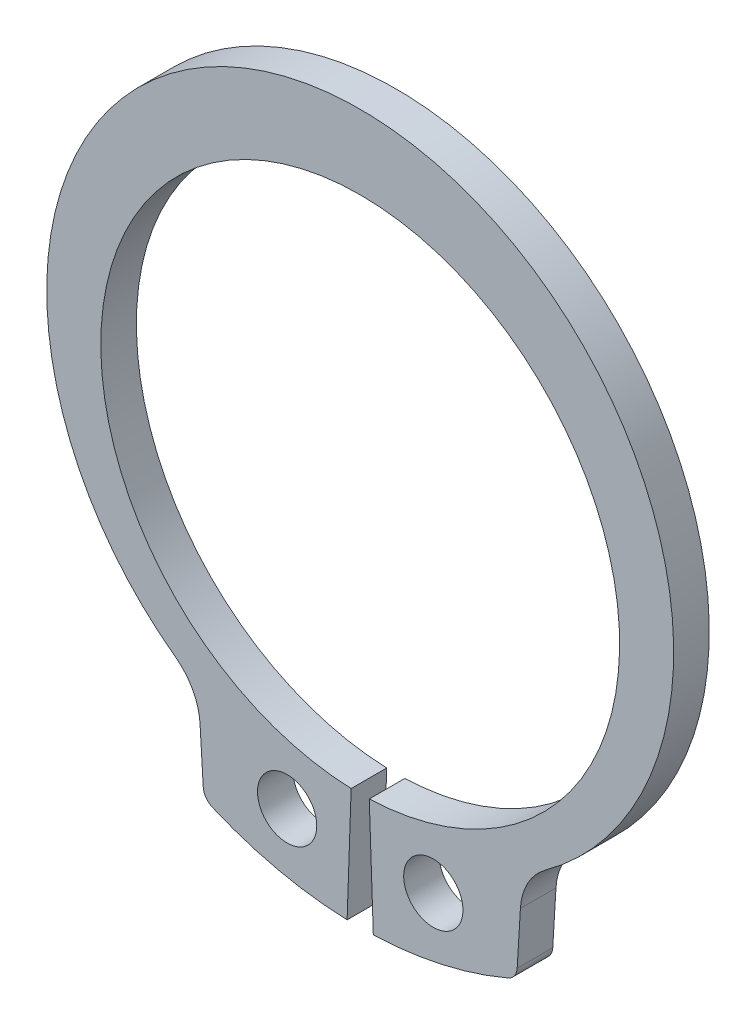
ISO-10303-21;
HEADER;
FILE_DESCRIPTION(('STEP AP214'),'2;1');
FILE_NAME('part.step','',(''),(''),'','','');
FILE_SCHEMA(('AUTOMOTIVE_DESIGN { 1 0 10303 214 1 1 1 1 }'));
ENDSEC;
DATA;
#1=APPLICATION_CONTEXT('core data for automotive mechanical design processes');
#2=APPLICATION_PROTOCOL_DEFINITION('international standard','automotive_design',2000,#1);
#3=PRODUCT_CONTEXT('',#1,'mechanical');
#4=PRODUCT('Part','Part','',(#3));
#5=PRODUCT_RELATED_PRODUCT_CATEGORY('part','',(#4));
#6=PRODUCT_DEFINITION_FORMATION('','',#4);
#7=PRODUCT_DEFINITION_CONTEXT('part definition',#1,'design');
#8=PRODUCT_DEFINITION('design','',#6,#7);
#9=PRODUCT_DEFINITION_SHAPE('','',#8);
#10=(LENGTH_UNIT() NAMED_UNIT(*) SI_UNIT(.MILLI.,.METRE.));
#11=(NAMED_UNIT(*) PLANE_ANGLE_UNIT() SI_UNIT($,.RADIAN.));
#12=(NAMED_UNIT(*) SI_UNIT($,.STERADIAN.) SOLID_ANGLE_UNIT());
#13=UNCERTAINTY_MEASURE_WITH_UNIT(LENGTH_MEASURE(1.E-05),#10,'distance_accuracy_value','');
#14=(GEOMETRIC_REPRESENTATION_CONTEXT(3) GLOBAL_UNCERTAINTY_ASSIGNED_CONTEXT((#13)) GLOBAL_UNIT_ASSIGNED_CONTEXT((#10,
#11,#12)) REPRESENTATION_CONTEXT('',''));
#15=CARTESIAN_POINT('',(0.,0.,0.));
#16=DIRECTION('',(0.,0.,1.));
#17=DIRECTION('',(1.,0.,0.));
#18=AXIS2_PLACEMENT_3D('',#15,#16,#17);
#19=CARTESIAN_POINT('',(0.,0.676745281118012,0.6));
#20=DIRECTION('',(0.,0.,1.));
#21=DIRECTION('',(1.,0.,0.));
#22=AXIS2_PLACEMENT_3D('',#19,#20,#21);
#23=PLANE('',#22);
#24=DIRECTION('',(0.0600552125805583,-0.998195056810994,0.));
#25=VECTOR('',#24,1.);
#26=CARTESIAN_POINT('',(-5.27574090146537,-11.5058332597497,0.6));
#27=LINE('',#26,#25);
#28=CARTESIAN_POINT('',(-5.40286054256007,-9.39294094096705,0.6));
#29=VERTEX_POINT('',#28);
#30=CARTESIAN_POINT('',(-5.29450519168984,-11.1939465651267,0.6));
#31=VERTEX_POINT('',#30);
#32=EDGE_CURVE('E196',#29,#31,#27,.T.);
#33=ORIENTED_EDGE('',*,*,#32,.T.);
#34=CARTESIAN_POINT('',(-4.78193236818255,-11.1631082338119,0.6));
#35=DIRECTION('',(0.,0.,1.));
#36=DIRECTION('',(1.,0.,0.));
#37=AXIS2_PLACEMENT_3D('',#34,#35,#36);
#38=CIRCLE('',#37,0.513499661223369);
#39=CARTESIAN_POINT('',(-4.98412917092754,-11.6351234401731,0.6));
#40=VERTEX_POINT('',#39);
#41=EDGE_CURVE('E12',#31,#40,#38,.T.);
#42=ORIENTED_EDGE('',*,*,#41,.T.);
#43=CARTESIAN_POINT('',(0.,0.,0.6));
#44=DIRECTION('',(0.,0.,1.));
#45=DIRECTION('',(1.,0.,0.));
#46=AXIS2_PLACEMENT_3D('',#43,#44,#45);
#47=CIRCLE('',#46,12.6577107353801);
#48=CARTESIAN_POINT('',(-0.441747734070617,-12.65,0.6));
#49=VERTEX_POINT('',#48);
#50=EDGE_CURVE('E199',#40,#49,#47,.T.);
#51=ORIENTED_EDGE('',*,*,#50,.T.);
#52=DIRECTION('',(0.0348994967024998,0.999390827019096,0.));
#53=VECTOR('',#52,1.);
#54=CARTESIAN_POINT('',(-0.441747734070617,-12.65,0.6));
#55=LINE('',#54,#53);
#56=CARTESIAN_POINT('',(-0.305370596146897,-8.74466973641709,0.6));
#57=VERTEX_POINT('',#56);
#58=EDGE_CURVE('E201',#49,#57,#55,.T.);
#59=ORIENTED_EDGE('',*,*,#58,.T.);
#60=CARTESIAN_POINT('',(0.,0.,0.6));
#61=DIRECTION('',(0.,0.,-1.));
#62=DIRECTION('',(1.,0.,0.));
#63=AXIS2_PLACEMENT_3D('',#60,#61,#62);
#64=CIRCLE('',#63,8.75);
#65=CARTESIAN_POINT('',(0.305370596146893,-8.74466973641709,0.6));
#66=VERTEX_POINT('',#65);
#67=EDGE_CURVE('E155',#57,#66,#64,.T.);
#68=ORIENTED_EDGE('',*,*,#67,.T.);
#69=DIRECTION('',(-0.0348994967024993,0.999390827019096,0.));
#70=VECTOR('',#69,1.);
#71=CARTESIAN_POINT('',(0.441747734070611,-12.65,0.6));
#72=LINE('',#71,#70);
#73=CARTESIAN_POINT('',(0.441747734070611,-12.65,0.6));
#74=VERTEX_POINT('',#73);
#75=EDGE_CURVE('E135',#74,#66,#72,.T.);
#76=ORIENTED_EDGE('',*,*,#75,.F.);
#77=CARTESIAN_POINT('',(0.,0.,0.6));
#78=DIRECTION('',(0.,0.,-1.));
#79=DIRECTION('',(-1.,0.,0.));
#80=AXIS2_PLACEMENT_3D('',#77,#78,#79);
#81=CIRCLE('',#80,12.6577107353801);
#82=CARTESIAN_POINT('',(4.98412917092754,-11.6351234401731,0.6));
#83=VERTEX_POINT('',#82);
#84=EDGE_CURVE('E145',#83,#74,#81,.T.);
#85=ORIENTED_EDGE('',*,*,#84,.F.);
#86=CARTESIAN_POINT('',(4.78193236818255,-11.1631082338119,0.6));
#87=DIRECTION('',(0.,0.,-1.));
#88=DIRECTION('',(-1.,0.,0.));
#89=AXIS2_PLACEMENT_3D('',#86,#87,#88);
#90=CIRCLE('',#89,0.513499661223369);
#91=CARTESIAN_POINT('',(5.29450519168983,-11.1939465651267,0.6));
#92=VERTEX_POINT('',#91);
#93=EDGE_CURVE('E184',#92,#83,#90,.T.);
#94=ORIENTED_EDGE('',*,*,#93,.F.);
#95=DIRECTION('',(-0.0600552125805588,-0.998195056810994,0.));
#96=VECTOR('',#95,1.);
#97=CARTESIAN_POINT('',(5.27574090146536,-11.5058332597497,0.6));
#98=LINE('',#97,#96);
#99=CARTESIAN_POINT('',(5.40286054256007,-9.39294094096706,0.6));
#100=VERTEX_POINT('',#99);
#101=EDGE_CURVE('E151',#100,#92,#98,.T.);
#102=ORIENTED_EDGE('',*,*,#101,.F.);
#103=CARTESIAN_POINT('',(7.45315183658921,-9.51629426622631,0.6));
#104=DIRECTION('',(0.,0.,-1.));
#105=DIRECTION('',(-1.,0.,0.));
#106=AXIS2_PLACEMENT_3D('',#103,#104,#105);
#107=CIRCLE('',#106,2.05399864489347);
#108=CARTESIAN_POINT('',(6.24079287526064,-7.85825440479037,0.6));
#109=VERTEX_POINT('',#108);
#110=EDGE_CURVE('E175',#109,#100,#107,.F.);
#111=ORIENTED_EDGE('',*,*,#110,.F.);
#112=CARTESIAN_POINT('',(0.,0.676745281118012,0.6));
#113=DIRECTION('',(0.,0.,1.));
#114=DIRECTION('',(1.,0.,0.));
#115=AXIS2_PLACEMENT_3D('',#112,#113,#114);
#116=CIRCLE('',#115,10.573254718882);
#117=CARTESIAN_POINT('',(-6.24079287526064,-7.85825440479036,0.6));
#118=VERTEX_POINT('',#117);
#119=EDGE_CURVE('E193',#109,#118,#116,.T.);
#120=ORIENTED_EDGE('',*,*,#119,.T.);
#121=CARTESIAN_POINT('',(-7.45315183658922,-9.51629426622631,0.6));
#122=DIRECTION('',(0.,0.,1.));
#123=DIRECTION('',(1.,0.,0.));
#124=AXIS2_PLACEMENT_3D('',#121,#122,#123);
#125=CIRCLE('',#124,2.05399864489347);
#126=EDGE_CURVE('E226',#118,#29,#125,.F.);
#127=ORIENTED_EDGE('',*,*,#126,.T.);
#128=EDGE_LOOP('',(#33,#42,#51,#59,#68,#76,#85,#94,#102,#111,#120,#127));
#129=FACE_BOUND('',#128,.T.);
#130=CARTESIAN_POINT('',(-2.46539678263405,-10.416061560715,0.6));
#131=DIRECTION('',(0.,0.,1.));
#132=DIRECTION('',(1.,0.,0.));
#133=AXIS2_PLACEMENT_3D('',#130,#131,#132);
#134=CIRCLE('',#133,1.);
#135=CARTESIAN_POINT('',(-1.46539678263405,-10.416061560715,0.6));
#136=VERTEX_POINT('',#135);
#137=EDGE_CURVE('E187',#136,#136,#134,.T.);
#138=ORIENTED_EDGE('',*,*,#137,.F.);
#139=EDGE_LOOP('',(#138));
#140=FACE_BOUND('',#139,.T.);
#141=CARTESIAN_POINT('',(2.46539678263404,-10.416061560715,0.6));
#142=DIRECTION('',(0.,0.,-1.));
#143=DIRECTION('',(-1.,0.,0.));
#144=AXIS2_PLACEMENT_3D('',#141,#142,#143);
#145=CIRCLE('',#144,1.);
#146=CARTESIAN_POINT('',(1.46539678263404,-10.416061560715,0.6));
#147=VERTEX_POINT('',#146);
#148=EDGE_CURVE('E165',#147,#147,#145,.T.);
#149=ORIENTED_EDGE('',*,*,#148,.T.);
#150=EDGE_LOOP('',(#149));
#151=FACE_BOUND('',#150,.T.);
#152=ADVANCED_FACE('F41',(#129,#140,#151),#23,.T.);
#153=CARTESIAN_POINT('',(0.,0.676745281118012,-0.6));
#154=DIRECTION('',(0.,0.,1.));
#155=DIRECTION('',(1.,0.,0.));
#156=AXIS2_PLACEMENT_3D('',#153,#154,#155);
#157=PLANE('',#156);
#158=CARTESIAN_POINT('',(0.,0.,-0.6));
#159=DIRECTION('',(0.,0.,1.));
#160=DIRECTION('',(1.,0.,0.));
#161=AXIS2_PLACEMENT_3D('',#158,#159,#160);
#162=CIRCLE('',#161,12.6577107353801);
#163=CARTESIAN_POINT('',(-4.98412917092754,-11.6351234401731,-0.6));
#164=VERTEX_POINT('',#163);
#165=CARTESIAN_POINT('',(-0.441747734070617,-12.65,-0.6));
#166=VERTEX_POINT('',#165);
#167=EDGE_CURVE('E209',#164,#166,#162,.T.);
#168=ORIENTED_EDGE('',*,*,#167,.F.);
#169=CARTESIAN_POINT('',(-4.78193236818255,-11.1631082338119,-0.6));
#170=DIRECTION('',(0.,0.,1.));
#171=DIRECTION('',(1.,0.,0.));
#172=AXIS2_PLACEMENT_3D('',#169,#170,#171);
#173=CIRCLE('',#172,0.513499661223369);
#174=CARTESIAN_POINT('',(-5.29450519168984,-11.1939465651267,-0.6));
#175=VERTEX_POINT('',#174);
#176=EDGE_CURVE('E63',#164,#175,#173,.F.);
#177=ORIENTED_EDGE('',*,*,#176,.T.);
#178=DIRECTION('',(0.0600552125805583,-0.998195056810994,0.));
#179=VECTOR('',#178,1.);
#180=CARTESIAN_POINT('',(-5.27574090146537,-11.5058332597497,-0.6));
#181=LINE('',#180,#179);
#182=CARTESIAN_POINT('',(-5.40286054256007,-9.39294094096705,-0.6));
#183=VERTEX_POINT('',#182);
#184=EDGE_CURVE('E207',#183,#175,#181,.T.);
#185=ORIENTED_EDGE('',*,*,#184,.F.);
#186=CARTESIAN_POINT('',(-7.45315183658922,-9.51629426622631,-0.6));
#187=DIRECTION('',(0.,0.,1.));
#188=DIRECTION('',(1.,0.,0.));
#189=AXIS2_PLACEMENT_3D('',#186,#187,#188);
#190=CIRCLE('',#189,2.05399864489347);
#191=CARTESIAN_POINT('',(-6.24079287526064,-7.85825440479036,-0.6));
#192=VERTEX_POINT('',#191);
#193=EDGE_CURVE('E224',#183,#192,#190,.T.);
#194=ORIENTED_EDGE('',*,*,#193,.T.);
#195=CARTESIAN_POINT('',(0.,0.676745281118012,-0.6));
#196=DIRECTION('',(0.,0.,1.));
#197=DIRECTION('',(1.,0.,0.));
#198=AXIS2_PLACEMENT_3D('',#195,#196,#197);
#199=CIRCLE('',#198,10.573254718882);
#200=CARTESIAN_POINT('',(6.24079287526064,-7.85825440479037,-0.6));
#201=VERTEX_POINT('',#200);
#202=EDGE_CURVE('E190',#201,#192,#199,.T.);
#203=ORIENTED_EDGE('',*,*,#202,.F.);
#204=CARTESIAN_POINT('',(7.45315183658921,-9.51629426622631,-0.6));
#205=DIRECTION('',(0.,0.,-1.));
#206=DIRECTION('',(-1.,0.,0.));
#207=AXIS2_PLACEMENT_3D('',#204,#205,#206);
#208=CIRCLE('',#207,2.05399864489347);
#209=CARTESIAN_POINT('',(5.40286054256007,-9.39294094096706,-0.6));
#210=VERTEX_POINT('',#209);
#211=EDGE_CURVE('E172',#210,#201,#208,.T.);
#212=ORIENTED_EDGE('',*,*,#211,.F.);
#213=DIRECTION('',(-0.0600552125805588,-0.998195056810994,0.));
#214=VECTOR('',#213,1.);
#215=CARTESIAN_POINT('',(5.27574090146536,-11.5058332597497,-0.6));
#216=LINE('',#215,#214);
#217=CARTESIAN_POINT('',(5.29450519168983,-11.1939465651267,-0.6));
#218=VERTEX_POINT('',#217);
#219=EDGE_CURVE('E161',#210,#218,#216,.T.);
#220=ORIENTED_EDGE('',*,*,#219,.T.);
#221=CARTESIAN_POINT('',(4.78193236818255,-11.1631082338119,-0.6));
#222=DIRECTION('',(0.,0.,-1.));
#223=DIRECTION('',(-1.,0.,0.));
#224=AXIS2_PLACEMENT_3D('',#221,#222,#223);
#225=CIRCLE('',#224,0.513499661223369);
#226=CARTESIAN_POINT('',(4.98412917092754,-11.6351234401731,-0.6));
#227=VERTEX_POINT('',#226);
#228=EDGE_CURVE('E179',#227,#218,#225,.F.);
#229=ORIENTED_EDGE('',*,*,#228,.F.);
#230=CARTESIAN_POINT('',(0.,0.,-0.6));
#231=DIRECTION('',(0.,0.,-1.));
#232=DIRECTION('',(-1.,0.,0.));
#233=AXIS2_PLACEMENT_3D('',#230,#231,#232);
#234=CIRCLE('',#233,12.6577107353801);
#235=CARTESIAN_POINT('',(0.441747734070611,-12.65,-0.6));
#236=VERTEX_POINT('',#235);
#237=EDGE_CURVE('E164',#227,#236,#234,.T.);
#238=ORIENTED_EDGE('',*,*,#237,.T.);
#239=DIRECTION('',(-0.0348994967024993,0.999390827019096,0.));
#240=VECTOR('',#239,1.);
#241=CARTESIAN_POINT('',(0.441747734070611,-12.65,-0.6));
#242=LINE('',#241,#240);
#243=CARTESIAN_POINT('',(0.305370596146893,-8.74466973641709,-0.6));
#244=VERTEX_POINT('',#243);
#245=EDGE_CURVE('E137',#236,#244,#242,.T.);
#246=ORIENTED_EDGE('',*,*,#245,.T.);
#247=CARTESIAN_POINT('',(0.,0.,-0.6));
#248=DIRECTION('',(0.,0.,-1.));
#249=DIRECTION('',(1.,0.,0.));
#250=AXIS2_PLACEMENT_3D('',#247,#248,#249);
#251=CIRCLE('',#250,8.75);
#252=CARTESIAN_POINT('',(-0.305370596146897,-8.74466973641709,-0.6));
#253=VERTEX_POINT('',#252);
#254=EDGE_CURVE('E197',#253,#244,#251,.T.);
#255=ORIENTED_EDGE('',*,*,#254,.F.);
#256=DIRECTION('',(0.0348994967024998,0.999390827019096,0.));
#257=VECTOR('',#256,1.);
#258=CARTESIAN_POINT('',(-0.441747734070617,-12.65,-0.6));
#259=LINE('',#258,#257);
#260=EDGE_CURVE('E211',#166,#253,#259,.T.);
#261=ORIENTED_EDGE('',*,*,#260,.F.);
#262=EDGE_LOOP('',(#168,#177,#185,#194,#203,#212,#220,#229,#238,#246,#255,#261));
#263=FACE_BOUND('',#262,.T.);
#264=CARTESIAN_POINT('',(-2.46539678263405,-10.416061560715,-0.6));
#265=DIRECTION('',(0.,0.,1.));
#266=DIRECTION('',(1.,0.,0.));
#267=AXIS2_PLACEMENT_3D('',#264,#265,#266);
#268=CIRCLE('',#267,1.);
#269=CARTESIAN_POINT('',(-1.46539678263405,-10.416061560715,-0.6));
#270=VERTEX_POINT('',#269);
#271=EDGE_CURVE('E186',#270,#270,#268,.T.);
#272=ORIENTED_EDGE('',*,*,#271,.T.);
#273=EDGE_LOOP('',(#272));
#274=FACE_BOUND('',#273,.T.);
#275=CARTESIAN_POINT('',(2.46539678263404,-10.416061560715,-0.6));
#276=DIRECTION('',(0.,0.,-1.));
#277=DIRECTION('',(-1.,0.,0.));
#278=AXIS2_PLACEMENT_3D('',#275,#276,#277);
#279=CIRCLE('',#278,1.);
#280=CARTESIAN_POINT('',(1.46539678263404,-10.416061560715,-0.6));
#281=VERTEX_POINT('',#280);
#282=EDGE_CURVE('E259',#281,#281,#279,.T.);
#283=ORIENTED_EDGE('',*,*,#282,.F.);
#284=EDGE_LOOP('',(#283));
#285=FACE_BOUND('',#284,.T.);
#286=ADVANCED_FACE('F239',(#263,#274,#285),#157,.F.);
#287=CARTESIAN_POINT('',(0.,0.676745281118012,0.6));
#288=DIRECTION('',(0.,0.,-1.));
#289=DIRECTION('',(-1.,0.,0.));
#290=AXIS2_PLACEMENT_3D('',#287,#288,#289);
#291=CYLINDRICAL_SURFACE('',#290,10.573254718882);
#292=ORIENTED_EDGE('',*,*,#202,.T.);
#293=DIRECTION('',(0.,0.,-1.));
#294=VECTOR('',#293,1.);
#295=CARTESIAN_POINT('',(-6.24079287526064,-7.85825440479036,0.6));
#296=LINE('',#295,#294);
#297=EDGE_CURVE('E222',#192,#118,#296,.F.);
#298=ORIENTED_EDGE('',*,*,#297,.T.);
#299=ORIENTED_EDGE('',*,*,#119,.F.);
#300=DIRECTION('',(0.,0.,-1.));
#301=VECTOR('',#300,1.);
#302=CARTESIAN_POINT('',(6.24079287526064,-7.85825440479037,0.6));
#303=LINE('',#302,#301);
#304=EDGE_CURVE('E169',#201,#109,#303,.F.);
#305=ORIENTED_EDGE('',*,*,#304,.F.);
#306=EDGE_LOOP('',(#292,#298,#299,#305));
#307=FACE_BOUND('',#306,.T.);
#308=ADVANCED_FACE('F274',(#307),#291,.T.);
#309=CARTESIAN_POINT('',(-5.27574090146537,-11.5058332597497,0.6));
#310=DIRECTION('',(0.998195056810994,0.0600552125805583,0.));
#311=DIRECTION('',(-0.0600552125805583,0.998195056810994,0.));
#312=AXIS2_PLACEMENT_3D('',#309,#310,#311);
#313=PLANE('',#312);
#314=ORIENTED_EDGE('',*,*,#184,.T.);
#315=DIRECTION('',(0.,0.,-1.));
#316=VECTOR('',#315,1.);
#317=CARTESIAN_POINT('',(-5.29450519168984,-11.1939465651267,0.6));
#318=LINE('',#317,#316);
#319=EDGE_CURVE('E49',#175,#31,#318,.F.);
#320=ORIENTED_EDGE('',*,*,#319,.T.);
#321=ORIENTED_EDGE('',*,*,#32,.F.);
#322=DIRECTION('',(0.,0.,1.));
#323=VECTOR('',#322,1.);
#324=CARTESIAN_POINT('',(-5.40286054256007,-9.39294094096705,-0.6));
#325=LINE('',#324,#323);
#326=EDGE_CURVE('E219',#29,#183,#325,.F.);
#327=ORIENTED_EDGE('',*,*,#326,.T.);
#328=EDGE_LOOP('',(#314,#320,#321,#327));
#329=FACE_BOUND('',#328,.T.);
#330=ADVANCED_FACE('F280',(#329),#313,.F.);
#331=CARTESIAN_POINT('',(0.,0.,0.6));
#332=DIRECTION('',(0.,0.,-1.));
#333=DIRECTION('',(-1.,0.,0.));
#334=AXIS2_PLACEMENT_3D('',#331,#332,#333);
#335=CYLINDRICAL_SURFACE('',#334,12.6577107353801);
#336=ORIENTED_EDGE('',*,*,#50,.F.);
#337=DIRECTION('',(0.,0.,-1.));
#338=VECTOR('',#337,1.);
#339=CARTESIAN_POINT('',(-4.98412917092754,-11.6351234401731,0.6));
#340=LINE('',#339,#338);
#341=EDGE_CURVE('E228',#40,#164,#340,.T.);
#342=ORIENTED_EDGE('',*,*,#341,.T.);
#343=ORIENTED_EDGE('',*,*,#167,.T.);
#344=DIRECTION('',(0.,0.,-1.));
#345=VECTOR('',#344,1.);
#346=CARTESIAN_POINT('',(-0.441747734070617,-12.65,0.6));
#347=LINE('',#346,#345);
#348=EDGE_CURVE('E216',#49,#166,#347,.T.);
#349=ORIENTED_EDGE('',*,*,#348,.F.);
#350=EDGE_LOOP('',(#336,#342,#343,#349));
#351=FACE_BOUND('',#350,.T.);
#352=ADVANCED_FACE('F234',(#351),#335,.T.);
#353=CARTESIAN_POINT('',(-0.441747734070617,-12.65,0.6));
#354=DIRECTION('',(-0.999390827019096,0.0348994967024998,0.));
#355=DIRECTION('',(-0.0348994967024998,-0.999390827019096,0.));
#356=AXIS2_PLACEMENT_3D('',#353,#354,#355);
#357=PLANE('',#356);
#358=ORIENTED_EDGE('',*,*,#260,.T.);
#359=DIRECTION('',(0.,0.,-1.));
#360=VECTOR('',#359,1.);
#361=CARTESIAN_POINT('',(-0.305370596146897,-8.74466973641709,0.6));
#362=LINE('',#361,#360);
#363=EDGE_CURVE('E204',#57,#253,#362,.T.);
#364=ORIENTED_EDGE('',*,*,#363,.F.);
#365=ORIENTED_EDGE('',*,*,#58,.F.);
#366=ORIENTED_EDGE('',*,*,#348,.T.);
#367=EDGE_LOOP('',(#358,#364,#365,#366));
#368=FACE_BOUND('',#367,.T.);
#369=ADVANCED_FACE('F244',(#368),#357,.F.);
#370=CARTESIAN_POINT('',(0.,0.,0.6));
#371=DIRECTION('',(0.,0.,-1.));
#372=DIRECTION('',(-1.,0.,0.));
#373=AXIS2_PLACEMENT_3D('',#370,#371,#372);
#374=CYLINDRICAL_SURFACE('',#373,8.75);
#375=ORIENTED_EDGE('',*,*,#254,.T.);
#376=DIRECTION('',(0.,0.,-1.));
#377=VECTOR('',#376,1.);
#378=CARTESIAN_POINT('',(0.305370596146893,-8.74466973641709,0.6));
#379=LINE('',#378,#377);
#380=EDGE_CURVE('E142',#66,#244,#379,.T.);
#381=ORIENTED_EDGE('',*,*,#380,.F.);
#382=ORIENTED_EDGE('',*,*,#67,.F.);
#383=ORIENTED_EDGE('',*,*,#363,.T.);
#384=EDGE_LOOP('',(#375,#381,#382,#383));
#385=FACE_BOUND('',#384,.T.);
#386=ADVANCED_FACE('F247',(#385),#374,.F.);
#387=CARTESIAN_POINT('',(-2.46539678263405,-10.416061560715,0.6));
#388=DIRECTION('',(0.,0.,-1.));
#389=DIRECTION('',(-1.,0.,0.));
#390=AXIS2_PLACEMENT_3D('',#387,#388,#389);
#391=CYLINDRICAL_SURFACE('',#390,1.);
#392=ORIENTED_EDGE('',*,*,#137,.T.);
#393=EDGE_LOOP('',(#392));
#394=FACE_BOUND('',#393,.T.);
#395=ORIENTED_EDGE('',*,*,#271,.F.);
#396=EDGE_LOOP('',(#395));
#397=FACE_BOUND('',#396,.T.);
#398=ADVANCED_FACE('F288',(#394,#397),#391,.F.);
#399=CARTESIAN_POINT('',(-7.45315183658922,-9.51629426622631,0.6));
#400=DIRECTION('',(0.,0.,-1.));
#401=DIRECTION('',(-1.,0.,0.));
#402=AXIS2_PLACEMENT_3D('',#399,#400,#401);
#403=CYLINDRICAL_SURFACE('',#402,2.05399864489347);
#404=ORIENTED_EDGE('',*,*,#126,.F.);
#405=ORIENTED_EDGE('',*,*,#297,.F.);
#406=ORIENTED_EDGE('',*,*,#193,.F.);
#407=ORIENTED_EDGE('',*,*,#326,.F.);
#408=EDGE_LOOP('',(#404,#405,#406,#407));
#409=FACE_BOUND('',#408,.T.);
#410=ADVANCED_FACE('F294',(#409),#403,.F.);
#411=CARTESIAN_POINT('',(-4.78193236818255,-11.1631082338119,0.6));
#412=DIRECTION('',(0.,0.,-1.));
#413=DIRECTION('',(-1.,0.,0.));
#414=AXIS2_PLACEMENT_3D('',#411,#412,#413);
#415=CYLINDRICAL_SURFACE('',#414,0.513499661223369);
#416=ORIENTED_EDGE('',*,*,#41,.F.);
#417=ORIENTED_EDGE('',*,*,#319,.F.);
#418=ORIENTED_EDGE('',*,*,#176,.F.);
#419=ORIENTED_EDGE('',*,*,#341,.F.);
#420=EDGE_LOOP('',(#416,#417,#418,#419));
#421=FACE_BOUND('',#420,.T.);
#422=ADVANCED_FACE('F43',(#421),#415,.T.);
#423=CARTESIAN_POINT('',(5.27574090146536,-11.5058332597497,0.6));
#424=DIRECTION('',(-0.998195056810994,0.0600552125805588,0.));
#425=DIRECTION('',(0.0600552125805588,0.998195056810994,0.));
#426=AXIS2_PLACEMENT_3D('',#423,#424,#425);
#427=PLANE('',#426);
#428=ORIENTED_EDGE('',*,*,#219,.F.);
#429=DIRECTION('',(0.,0.,1.));
#430=VECTOR('',#429,1.);
#431=CARTESIAN_POINT('',(5.40286054256007,-9.39294094096706,-0.6));
#432=LINE('',#431,#430);
#433=EDGE_CURVE('E141',#100,#210,#432,.F.);
#434=ORIENTED_EDGE('',*,*,#433,.F.);
#435=ORIENTED_EDGE('',*,*,#101,.T.);
#436=DIRECTION('',(0.,0.,-1.));
#437=VECTOR('',#436,1.);
#438=CARTESIAN_POINT('',(5.29450519168983,-11.1939465651267,0.6));
#439=LINE('',#438,#437);
#440=EDGE_CURVE('E182',#218,#92,#439,.F.);
#441=ORIENTED_EDGE('',*,*,#440,.F.);
#442=EDGE_LOOP('',(#428,#434,#435,#441));
#443=FACE_BOUND('',#442,.T.);
#444=ADVANCED_FACE('F257',(#443),#427,.F.);
#445=CARTESIAN_POINT('',(0.,0.,0.6));
#446=DIRECTION('',(0.,0.,-1.));
#447=DIRECTION('',(1.,0.,0.));
#448=AXIS2_PLACEMENT_3D('',#445,#446,#447);
#449=CYLINDRICAL_SURFACE('',#448,12.6577107353801);
#450=ORIENTED_EDGE('',*,*,#84,.T.);
#451=DIRECTION('',(0.,0.,-1.));
#452=VECTOR('',#451,1.);
#453=CARTESIAN_POINT('',(0.441747734070611,-12.65,0.6));
#454=LINE('',#453,#452);
#455=EDGE_CURVE('E130',#74,#236,#454,.T.);
#456=ORIENTED_EDGE('',*,*,#455,.T.);
#457=ORIENTED_EDGE('',*,*,#237,.F.);
#458=DIRECTION('',(0.,0.,-1.));
#459=VECTOR('',#458,1.);
#460=CARTESIAN_POINT('',(4.98412917092753,-11.6351234401731,0.6));
#461=LINE('',#460,#459);
#462=EDGE_CURVE('E147',#83,#227,#461,.T.);
#463=ORIENTED_EDGE('',*,*,#462,.F.);
#464=EDGE_LOOP('',(#450,#456,#457,#463));
#465=FACE_BOUND('',#464,.T.);
#466=ADVANCED_FACE('F146',(#465),#449,.T.);
#467=CARTESIAN_POINT('',(0.441747734070611,-12.65,0.6));
#468=DIRECTION('',(0.999390827019096,0.0348994967024993,0.));
#469=DIRECTION('',(0.0348994967024993,-0.999390827019096,0.));
#470=AXIS2_PLACEMENT_3D('',#467,#468,#469);
#471=PLANE('',#470);
#472=ORIENTED_EDGE('',*,*,#245,.F.);
#473=ORIENTED_EDGE('',*,*,#455,.F.);
#474=ORIENTED_EDGE('',*,*,#75,.T.);
#475=ORIENTED_EDGE('',*,*,#380,.T.);
#476=EDGE_LOOP('',(#472,#473,#474,#475));
#477=FACE_BOUND('',#476,.T.);
#478=ADVANCED_FACE('F132',(#477),#471,.F.);
#479=CARTESIAN_POINT('',(2.46539678263404,-10.416061560715,0.6));
#480=DIRECTION('',(0.,0.,-1.));
#481=DIRECTION('',(1.,0.,0.));
#482=AXIS2_PLACEMENT_3D('',#479,#480,#481);
#483=CYLINDRICAL_SURFACE('',#482,1.);
#484=ORIENTED_EDGE('',*,*,#148,.F.);
#485=EDGE_LOOP('',(#484));
#486=FACE_BOUND('',#485,.T.);
#487=ORIENTED_EDGE('',*,*,#282,.T.);
#488=EDGE_LOOP('',(#487));
#489=FACE_BOUND('',#488,.T.);
#490=ADVANCED_FACE('F266',(#486,#489),#483,.F.);
#491=CARTESIAN_POINT('',(7.45315183658921,-9.51629426622631,0.6));
#492=DIRECTION('',(0.,0.,-1.));
#493=DIRECTION('',(1.,0.,0.));
#494=AXIS2_PLACEMENT_3D('',#491,#492,#493);
#495=CYLINDRICAL_SURFACE('',#494,2.05399864489347);
#496=ORIENTED_EDGE('',*,*,#110,.T.);
#497=ORIENTED_EDGE('',*,*,#433,.T.);
#498=ORIENTED_EDGE('',*,*,#211,.T.);
#499=ORIENTED_EDGE('',*,*,#304,.T.);
#500=EDGE_LOOP('',(#496,#497,#498,#499));
#501=FACE_BOUND('',#500,.T.);
#502=ADVANCED_FACE('F269',(#501),#495,.F.);
#503=CARTESIAN_POINT('',(4.78193236818255,-11.1631082338119,0.6));
#504=DIRECTION('',(0.,0.,-1.));
#505=DIRECTION('',(1.,0.,0.));
#506=AXIS2_PLACEMENT_3D('',#503,#504,#505);
#507=CYLINDRICAL_SURFACE('',#506,0.513499661223369);
#508=ORIENTED_EDGE('',*,*,#93,.T.);
#509=ORIENTED_EDGE('',*,*,#462,.T.);
#510=ORIENTED_EDGE('',*,*,#228,.T.);
#511=ORIENTED_EDGE('',*,*,#440,.T.);
#512=EDGE_LOOP('',(#508,#509,#510,#511));
#513=FACE_BOUND('',#512,.T.);
#514=ADVANCED_FACE('F252',(#513),#507,.T.);
#515=CLOSED_SHELL('',(#152,#286,#308,#330,#352,#369,#386,#398,#410,#422,#444,#466,#478,#490,
#502,#514));
#516=MANIFOLD_SOLID_BREP('B2',#515);
#517=ADVANCED_BREP_SHAPE_REPRESENTATION('',(#18,#516),#14);
#518=SHAPE_DEFINITION_REPRESENTATION(#9,#517);
ENDSEC;
END-ISO-10303-21;
